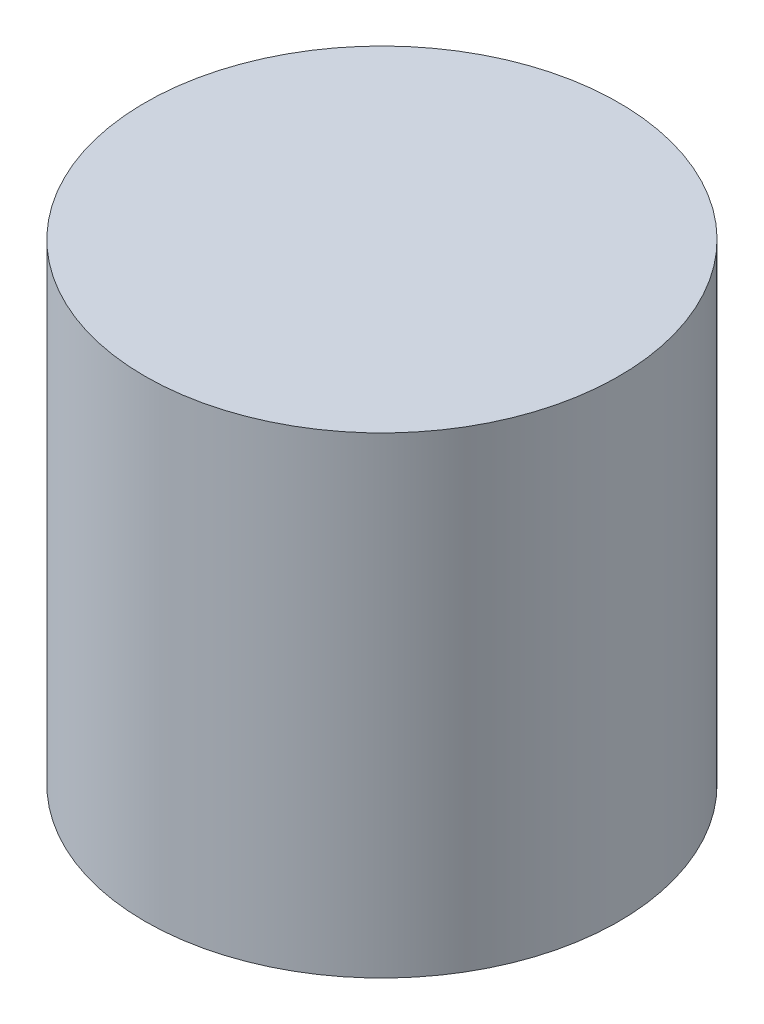
ISO-10303-21;
HEADER;
FILE_DESCRIPTION(('STEP AP214'),'2;1');
FILE_NAME('part.step','',(''),(''),'','','');
FILE_SCHEMA(('AUTOMOTIVE_DESIGN { 1 0 10303 214 1 1 1 1 }'));
ENDSEC;
DATA;
#1=APPLICATION_CONTEXT('core data for automotive mechanical design processes');
#2=APPLICATION_PROTOCOL_DEFINITION('international standard','automotive_design',2000,#1);
#3=PRODUCT_CONTEXT('',#1,'mechanical');
#4=PRODUCT('Part','Part','',(#3));
#5=PRODUCT_RELATED_PRODUCT_CATEGORY('part','',(#4));
#6=PRODUCT_DEFINITION_FORMATION('','',#4);
#7=PRODUCT_DEFINITION_CONTEXT('part definition',#1,'design');
#8=PRODUCT_DEFINITION('design','',#6,#7);
#9=PRODUCT_DEFINITION_SHAPE('','',#8);
#10=(LENGTH_UNIT() NAMED_UNIT(*) SI_UNIT(.MILLI.,.METRE.));
#11=(NAMED_UNIT(*) PLANE_ANGLE_UNIT() SI_UNIT($,.RADIAN.));
#12=(NAMED_UNIT(*) SI_UNIT($,.STERADIAN.) SOLID_ANGLE_UNIT());
#13=UNCERTAINTY_MEASURE_WITH_UNIT(LENGTH_MEASURE(1.E-05),#10,'distance_accuracy_value','');
#14=(GEOMETRIC_REPRESENTATION_CONTEXT(3) GLOBAL_UNCERTAINTY_ASSIGNED_CONTEXT((#13)) GLOBAL_UNIT_ASSIGNED_CONTEXT((#10,
#11,#12)) REPRESENTATION_CONTEXT('',''));
#15=CARTESIAN_POINT('',(0.,0.,0.));
#16=DIRECTION('',(0.,0.,1.));
#17=DIRECTION('',(1.,0.,0.));
#18=AXIS2_PLACEMENT_3D('',#15,#16,#17);
#19=CARTESIAN_POINT('',(0.,9.961,0.));
#20=DIRECTION('',(0.,-1.,0.));
#21=DIRECTION('',(0.,0.,-1.));
#22=AXIS2_PLACEMENT_3D('',#19,#20,#21);
#23=CYLINDRICAL_SURFACE('',#22,5.);
#24=CARTESIAN_POINT('',(0.,9.961,0.));
#25=DIRECTION('',(0.,1.,0.));
#26=DIRECTION('',(0.,0.,1.));
#27=AXIS2_PLACEMENT_3D('',#24,#25,#26);
#28=CIRCLE('',#27,5.);
#29=CARTESIAN_POINT('',(0.,9.961,5.));
#30=VERTEX_POINT('',#29);
#31=EDGE_CURVE('E10',#30,#30,#28,.T.);
#32=ORIENTED_EDGE('',*,*,#31,.F.);
#33=EDGE_LOOP('',(#32));
#34=FACE_BOUND('',#33,.T.);
#35=CARTESIAN_POINT('',(0.,0.,0.));
#36=DIRECTION('',(0.,1.,0.));
#37=DIRECTION('',(0.,0.,1.));
#38=AXIS2_PLACEMENT_3D('',#35,#36,#37);
#39=CIRCLE('',#38,5.);
#40=CARTESIAN_POINT('',(0.,0.,5.));
#41=VERTEX_POINT('',#40);
#42=EDGE_CURVE('E46',#41,#41,#39,.T.);
#43=ORIENTED_EDGE('',*,*,#42,.T.);
#44=EDGE_LOOP('',(#43));
#45=FACE_BOUND('',#44,.T.);
#46=ADVANCED_FACE('F43',(#34,#45),#23,.T.);
#47=CARTESIAN_POINT('',(0.,9.961,0.));
#48=DIRECTION('',(0.,1.,0.));
#49=DIRECTION('',(0.,0.,1.));
#50=AXIS2_PLACEMENT_3D('',#47,#48,#49);
#51=PLANE('',#50);
#52=ORIENTED_EDGE('',*,*,#31,.T.);
#53=EDGE_LOOP('',(#52));
#54=FACE_BOUND('',#53,.T.);
#55=ADVANCED_FACE('F58',(#54),#51,.T.);
#56=CARTESIAN_POINT('',(0.,0.,0.));
#57=DIRECTION('',(0.,1.,0.));
#58=DIRECTION('',(0.,0.,1.));
#59=AXIS2_PLACEMENT_3D('',#56,#57,#58);
#60=PLANE('',#59);
#61=ORIENTED_EDGE('',*,*,#42,.F.);
#62=EDGE_LOOP('',(#61));
#63=FACE_BOUND('',#62,.T.);
#64=ADVANCED_FACE('F59',(#63),#60,.F.);
#65=CLOSED_SHELL('',(#46,#55,#64));
#66=MANIFOLD_SOLID_BREP('B2',#65);
#67=ADVANCED_BREP_SHAPE_REPRESENTATION('',(#18,#66),#14);
#68=SHAPE_DEFINITION_REPRESENTATION(#9,#67);
ENDSEC;
END-ISO-10303-21;
